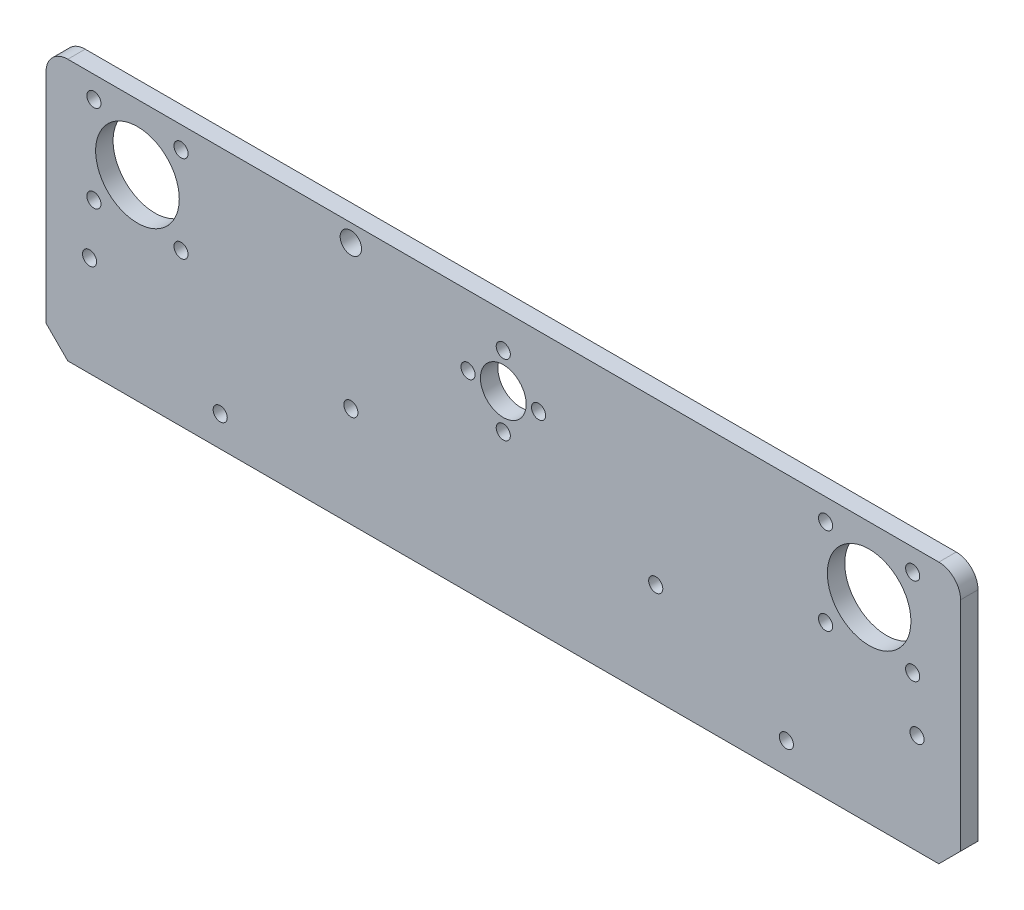
ISO-10303-21;
HEADER;
FILE_DESCRIPTION(('STEP AP214'),'2;1');
FILE_NAME('part.step','',(''),(''),'','','');
FILE_SCHEMA(('AUTOMOTIVE_DESIGN { 1 0 10303 214 1 1 1 1 }'));
ENDSEC;
DATA;
#1=APPLICATION_CONTEXT('core data for automotive mechanical design processes');
#2=APPLICATION_PROTOCOL_DEFINITION('international standard','automotive_design',2000,#1);
#3=PRODUCT_CONTEXT('',#1,'mechanical');
#4=PRODUCT('Part','Part','',(#3));
#5=PRODUCT_RELATED_PRODUCT_CATEGORY('part','',(#4));
#6=PRODUCT_DEFINITION_FORMATION('','',#4);
#7=PRODUCT_DEFINITION_CONTEXT('part definition',#1,'design');
#8=PRODUCT_DEFINITION('design','',#6,#7);
#9=PRODUCT_DEFINITION_SHAPE('','',#8);
#10=(LENGTH_UNIT() NAMED_UNIT(*) SI_UNIT(.MILLI.,.METRE.));
#11=(NAMED_UNIT(*) PLANE_ANGLE_UNIT() SI_UNIT($,.RADIAN.));
#12=(NAMED_UNIT(*) SI_UNIT($,.STERADIAN.) SOLID_ANGLE_UNIT());
#13=UNCERTAINTY_MEASURE_WITH_UNIT(LENGTH_MEASURE(1.E-05),#10,'distance_accuracy_value','');
#14=(GEOMETRIC_REPRESENTATION_CONTEXT(3) GLOBAL_UNCERTAINTY_ASSIGNED_CONTEXT((#13)) GLOBAL_UNIT_ASSIGNED_CONTEXT((#10,
#11,#12)) REPRESENTATION_CONTEXT('',''));
#15=CARTESIAN_POINT('',(0.,0.,0.));
#16=DIRECTION('',(0.,0.,1.));
#17=DIRECTION('',(1.,0.,0.));
#18=AXIS2_PLACEMENT_3D('',#15,#16,#17);
#19=CARTESIAN_POINT('',(0.,0.,4.));
#20=DIRECTION('',(0.,0.,1.));
#21=DIRECTION('',(1.,0.,0.));
#22=AXIS2_PLACEMENT_3D('',#19,#20,#21);
#23=PLANE('',#22);
#24=CARTESIAN_POINT('',(84.,15.,4.));
#25=DIRECTION('',(0.,0.,1.));
#26=DIRECTION('',(1.,0.,0.));
#27=AXIS2_PLACEMENT_3D('',#24,#25,#26);
#28=CIRCLE('',#27,9.6);
#29=CARTESIAN_POINT('',(93.6,15.,4.));
#30=VERTEX_POINT('',#29);
#31=EDGE_CURVE('E258',#30,#30,#28,.F.);
#32=ORIENTED_EDGE('',*,*,#31,.T.);
#33=EDGE_LOOP('',(#32));
#34=FACE_BOUND('',#33,.T.);
#35=CARTESIAN_POINT('',(-84.,15.,4.));
#36=DIRECTION('',(0.,0.,1.));
#37=DIRECTION('',(1.,0.,0.));
#38=AXIS2_PLACEMENT_3D('',#35,#36,#37);
#39=CIRCLE('',#38,9.6);
#40=CARTESIAN_POINT('',(-74.4,15.,4.));
#41=VERTEX_POINT('',#40);
#42=EDGE_CURVE('E261',#41,#41,#39,.F.);
#43=ORIENTED_EDGE('',*,*,#42,.T.);
#44=EDGE_LOOP('',(#43));
#45=FACE_BOUND('',#44,.T.);
#46=CARTESIAN_POINT('',(74.,25.,4.));
#47=DIRECTION('',(0.,0.,1.));
#48=DIRECTION('',(1.,0.,0.));
#49=AXIS2_PLACEMENT_3D('',#46,#47,#48);
#50=CIRCLE('',#49,1.621);
#51=CARTESIAN_POINT('',(75.621,25.,4.));
#52=VERTEX_POINT('',#51);
#53=EDGE_CURVE('E266',#52,#52,#50,.F.);
#54=ORIENTED_EDGE('',*,*,#53,.T.);
#55=EDGE_LOOP('',(#54));
#56=FACE_BOUND('',#55,.T.);
#57=CARTESIAN_POINT('',(94.,5.00000000000002,4.));
#58=DIRECTION('',(0.,0.,1.));
#59=DIRECTION('',(1.,0.,0.));
#60=AXIS2_PLACEMENT_3D('',#57,#58,#59);
#61=CIRCLE('',#60,1.621);
#62=CARTESIAN_POINT('',(95.621,5.00000000000002,4.));
#63=VERTEX_POINT('',#62);
#64=EDGE_CURVE('E271',#63,#63,#61,.F.);
#65=ORIENTED_EDGE('',*,*,#64,.T.);
#66=EDGE_LOOP('',(#65));
#67=FACE_BOUND('',#66,.T.);
#68=CARTESIAN_POINT('',(-94.,5.,4.));
#69=DIRECTION('',(0.,0.,1.));
#70=DIRECTION('',(1.,0.,0.));
#71=AXIS2_PLACEMENT_3D('',#68,#69,#70);
#72=CIRCLE('',#71,1.621);
#73=CARTESIAN_POINT('',(-92.379,5.,4.));
#74=VERTEX_POINT('',#73);
#75=EDGE_CURVE('E276',#74,#74,#72,.F.);
#76=ORIENTED_EDGE('',*,*,#75,.T.);
#77=EDGE_LOOP('',(#76));
#78=FACE_BOUND('',#77,.T.);
#79=CARTESIAN_POINT('',(-74.,25.,4.));
#80=DIRECTION('',(0.,0.,1.));
#81=DIRECTION('',(1.,0.,0.));
#82=AXIS2_PLACEMENT_3D('',#79,#80,#81);
#83=CIRCLE('',#82,1.621);
#84=CARTESIAN_POINT('',(-72.379,25.,4.));
#85=VERTEX_POINT('',#84);
#86=EDGE_CURVE('E281',#85,#85,#83,.F.);
#87=ORIENTED_EDGE('',*,*,#86,.T.);
#88=EDGE_LOOP('',(#87));
#89=FACE_BOUND('',#88,.T.);
#90=CARTESIAN_POINT('',(-74.,5.,4.));
#91=DIRECTION('',(0.,0.,1.));
#92=DIRECTION('',(1.,0.,0.));
#93=AXIS2_PLACEMENT_3D('',#90,#91,#92);
#94=CIRCLE('',#93,1.621);
#95=CARTESIAN_POINT('',(-72.379,5.,4.));
#96=VERTEX_POINT('',#95);
#97=EDGE_CURVE('E286',#96,#96,#94,.F.);
#98=ORIENTED_EDGE('',*,*,#97,.T.);
#99=EDGE_LOOP('',(#98));
#100=FACE_BOUND('',#99,.T.);
#101=CARTESIAN_POINT('',(-94.,25.,4.));
#102=DIRECTION('',(0.,0.,1.));
#103=DIRECTION('',(1.,0.,0.));
#104=AXIS2_PLACEMENT_3D('',#101,#102,#103);
#105=CIRCLE('',#104,1.621);
#106=CARTESIAN_POINT('',(-92.379,25.,4.));
#107=VERTEX_POINT('',#106);
#108=EDGE_CURVE('E291',#107,#107,#105,.F.);
#109=ORIENTED_EDGE('',*,*,#108,.T.);
#110=EDGE_LOOP('',(#109));
#111=FACE_BOUND('',#110,.T.);
#112=CARTESIAN_POINT('',(94.,25.,4.));
#113=DIRECTION('',(0.,0.,1.));
#114=DIRECTION('',(1.,0.,0.));
#115=AXIS2_PLACEMENT_3D('',#112,#113,#114);
#116=CIRCLE('',#115,1.621);
#117=CARTESIAN_POINT('',(95.621,25.,4.));
#118=VERTEX_POINT('',#117);
#119=EDGE_CURVE('E296',#118,#118,#116,.F.);
#120=ORIENTED_EDGE('',*,*,#119,.T.);
#121=EDGE_LOOP('',(#120));
#122=FACE_BOUND('',#121,.T.);
#123=CARTESIAN_POINT('',(74.,5.00000000000001,4.));
#124=DIRECTION('',(0.,0.,1.));
#125=DIRECTION('',(1.,0.,0.));
#126=AXIS2_PLACEMENT_3D('',#123,#124,#125);
#127=CIRCLE('',#126,1.621);
#128=CARTESIAN_POINT('',(75.621,5.00000000000001,4.));
#129=VERTEX_POINT('',#128);
#130=EDGE_CURVE('E301',#129,#129,#127,.F.);
#131=ORIENTED_EDGE('',*,*,#130,.T.);
#132=EDGE_LOOP('',(#131));
#133=FACE_BOUND('',#132,.T.);
#134=CARTESIAN_POINT('',(-95.,-7.,4.));
#135=DIRECTION('',(0.,0.,1.));
#136=DIRECTION('',(1.,0.,0.));
#137=AXIS2_PLACEMENT_3D('',#134,#135,#136);
#138=CIRCLE('',#137,1.621);
#139=CARTESIAN_POINT('',(-93.379,-7.,4.));
#140=VERTEX_POINT('',#139);
#141=EDGE_CURVE('E306',#140,#140,#138,.F.);
#142=ORIENTED_EDGE('',*,*,#141,.T.);
#143=EDGE_LOOP('',(#142));
#144=FACE_BOUND('',#143,.T.);
#145=CARTESIAN_POINT('',(65.,-23.,4.));
#146=DIRECTION('',(0.,0.,1.));
#147=DIRECTION('',(1.,0.,0.));
#148=AXIS2_PLACEMENT_3D('',#145,#146,#147);
#149=CIRCLE('',#148,1.621);
#150=CARTESIAN_POINT('',(66.621,-23.,4.));
#151=VERTEX_POINT('',#150);
#152=EDGE_CURVE('E311',#151,#151,#149,.F.);
#153=ORIENTED_EDGE('',*,*,#152,.T.);
#154=EDGE_LOOP('',(#153));
#155=FACE_BOUND('',#154,.T.);
#156=CARTESIAN_POINT('',(35.,-7.,4.));
#157=DIRECTION('',(0.,0.,1.));
#158=DIRECTION('',(1.,0.,0.));
#159=AXIS2_PLACEMENT_3D('',#156,#157,#158);
#160=CIRCLE('',#159,1.621);
#161=CARTESIAN_POINT('',(36.621,-7.,4.));
#162=VERTEX_POINT('',#161);
#163=EDGE_CURVE('E316',#162,#162,#160,.F.);
#164=ORIENTED_EDGE('',*,*,#163,.T.);
#165=EDGE_LOOP('',(#164));
#166=FACE_BOUND('',#165,.T.);
#167=CARTESIAN_POINT('',(-35.,-7.,4.));
#168=DIRECTION('',(0.,0.,1.));
#169=DIRECTION('',(1.,0.,0.));
#170=AXIS2_PLACEMENT_3D('',#167,#168,#169);
#171=CIRCLE('',#170,1.621);
#172=CARTESIAN_POINT('',(-33.379,-7.,4.));
#173=VERTEX_POINT('',#172);
#174=EDGE_CURVE('E321',#173,#173,#171,.F.);
#175=ORIENTED_EDGE('',*,*,#174,.T.);
#176=EDGE_LOOP('',(#175));
#177=FACE_BOUND('',#176,.T.);
#178=CARTESIAN_POINT('',(95.,-7.,4.));
#179=DIRECTION('',(0.,0.,1.));
#180=DIRECTION('',(1.,0.,0.));
#181=AXIS2_PLACEMENT_3D('',#178,#179,#180);
#182=CIRCLE('',#181,1.621);
#183=CARTESIAN_POINT('',(96.621,-7.,4.));
#184=VERTEX_POINT('',#183);
#185=EDGE_CURVE('E326',#184,#184,#182,.F.);
#186=ORIENTED_EDGE('',*,*,#185,.T.);
#187=EDGE_LOOP('',(#186));
#188=FACE_BOUND('',#187,.T.);
#189=CARTESIAN_POINT('',(-65.,-23.,4.));
#190=DIRECTION('',(0.,0.,1.));
#191=DIRECTION('',(1.,0.,0.));
#192=AXIS2_PLACEMENT_3D('',#189,#190,#191);
#193=CIRCLE('',#192,1.621);
#194=CARTESIAN_POINT('',(-63.379,-23.,4.));
#195=VERTEX_POINT('',#194);
#196=EDGE_CURVE('E331',#195,#195,#193,.F.);
#197=ORIENTED_EDGE('',*,*,#196,.T.);
#198=EDGE_LOOP('',(#197));
#199=FACE_BOUND('',#198,.T.);
#200=CARTESIAN_POINT('',(0.,14.,4.));
#201=DIRECTION('',(0.,0.,-1.));
#202=DIRECTION('',(-1.,0.,0.));
#203=AXIS2_PLACEMENT_3D('',#200,#201,#202);
#204=CIRCLE('',#203,5.25);
#205=CARTESIAN_POINT('',(-5.25,14.,4.));
#206=VERTEX_POINT('',#205);
#207=EDGE_CURVE('E336',#206,#206,#204,.T.);
#208=ORIENTED_EDGE('',*,*,#207,.T.);
#209=EDGE_LOOP('',(#208));
#210=FACE_BOUND('',#209,.T.);
#211=CARTESIAN_POINT('',(0.,22.1,4.));
#212=DIRECTION('',(0.,0.,1.));
#213=DIRECTION('',(1.,0.,0.));
#214=AXIS2_PLACEMENT_3D('',#211,#212,#213);
#215=CIRCLE('',#214,1.621);
#216=CARTESIAN_POINT('',(1.621,22.1,4.));
#217=VERTEX_POINT('',#216);
#218=EDGE_CURVE('E341',#217,#217,#215,.F.);
#219=ORIENTED_EDGE('',*,*,#218,.T.);
#220=EDGE_LOOP('',(#219));
#221=FACE_BOUND('',#220,.T.);
#222=CARTESIAN_POINT('',(-8.1,14.,4.));
#223=DIRECTION('',(0.,0.,1.));
#224=DIRECTION('',(1.,0.,0.));
#225=AXIS2_PLACEMENT_3D('',#222,#223,#224);
#226=CIRCLE('',#225,1.621);
#227=CARTESIAN_POINT('',(-6.479,14.,4.));
#228=VERTEX_POINT('',#227);
#229=EDGE_CURVE('E346',#228,#228,#226,.F.);
#230=ORIENTED_EDGE('',*,*,#229,.T.);
#231=EDGE_LOOP('',(#230));
#232=FACE_BOUND('',#231,.T.);
#233=CARTESIAN_POINT('',(8.1,14.,4.));
#234=DIRECTION('',(0.,0.,1.));
#235=DIRECTION('',(1.,0.,0.));
#236=AXIS2_PLACEMENT_3D('',#233,#234,#235);
#237=CIRCLE('',#236,1.621);
#238=CARTESIAN_POINT('',(9.721,14.,4.));
#239=VERTEX_POINT('',#238);
#240=EDGE_CURVE('E351',#239,#239,#237,.F.);
#241=ORIENTED_EDGE('',*,*,#240,.T.);
#242=EDGE_LOOP('',(#241));
#243=FACE_BOUND('',#242,.T.);
#244=CARTESIAN_POINT('',(0.,5.9,4.));
#245=DIRECTION('',(0.,0.,1.));
#246=DIRECTION('',(1.,0.,0.));
#247=AXIS2_PLACEMENT_3D('',#244,#245,#246);
#248=CIRCLE('',#247,1.621);
#249=CARTESIAN_POINT('',(1.621,5.9,4.));
#250=VERTEX_POINT('',#249);
#251=EDGE_CURVE('E356',#250,#250,#248,.F.);
#252=ORIENTED_EDGE('',*,*,#251,.T.);
#253=EDGE_LOOP('',(#252));
#254=FACE_BOUND('',#253,.T.);
#255=CARTESIAN_POINT('',(-35.,26.,4.));
#256=DIRECTION('',(0.,0.,1.));
#257=DIRECTION('',(1.,0.,0.));
#258=AXIS2_PLACEMENT_3D('',#255,#256,#257);
#259=CIRCLE('',#258,2.4585);
#260=CARTESIAN_POINT('',(-32.5415,26.,4.));
#261=VERTEX_POINT('',#260);
#262=EDGE_CURVE('E108',#261,#261,#259,.F.);
#263=ORIENTED_EDGE('',*,*,#262,.T.);
#264=EDGE_LOOP('',(#263));
#265=FACE_BOUND('',#264,.T.);
#266=DIRECTION('',(0.707106781186548,-0.707106781186548,0.));
#267=VECTOR('',#266,1.);
#268=CARTESIAN_POINT('',(-102.5,-27.5,4.));
#269=LINE('',#268,#267);
#270=CARTESIAN_POINT('',(-100.,-30.,4.));
#271=VERTEX_POINT('',#270);
#272=CARTESIAN_POINT('',(-105.,-25.,4.));
#273=VERTEX_POINT('',#272);
#274=EDGE_CURVE('E131',#271,#273,#269,.F.);
#275=ORIENTED_EDGE('',*,*,#274,.F.);
#276=DIRECTION('',(1.,0.,0.));
#277=VECTOR('',#276,1.);
#278=CARTESIAN_POINT('',(-105.,-30.,4.));
#279=LINE('',#278,#277);
#280=CARTESIAN_POINT('',(100.,-30.,4.));
#281=VERTEX_POINT('',#280);
#282=EDGE_CURVE('E123',#281,#271,#279,.F.);
#283=ORIENTED_EDGE('',*,*,#282,.F.);
#284=DIRECTION('',(0.707106781186548,0.707106781186548,0.));
#285=VECTOR('',#284,1.);
#286=CARTESIAN_POINT('',(102.5,-27.5,4.));
#287=LINE('',#286,#285);
#288=CARTESIAN_POINT('',(105.,-25.,4.));
#289=VERTEX_POINT('',#288);
#290=EDGE_CURVE('E93',#289,#281,#287,.F.);
#291=ORIENTED_EDGE('',*,*,#290,.F.);
#292=DIRECTION('',(0.,1.,0.));
#293=VECTOR('',#292,1.);
#294=CARTESIAN_POINT('',(105.,-30.,4.));
#295=LINE('',#294,#293);
#296=CARTESIAN_POINT('',(105.,25.,4.));
#297=VERTEX_POINT('',#296);
#298=EDGE_CURVE('E89',#297,#289,#295,.F.);
#299=ORIENTED_EDGE('',*,*,#298,.F.);
#300=CARTESIAN_POINT('',(100.,25.,4.));
#301=DIRECTION('',(0.,0.,1.));
#302=DIRECTION('',(1.,0.,0.));
#303=AXIS2_PLACEMENT_3D('',#300,#301,#302);
#304=CIRCLE('',#303,5.);
#305=CARTESIAN_POINT('',(100.,30.,4.));
#306=VERTEX_POINT('',#305);
#307=EDGE_CURVE('E20',#306,#297,#304,.F.);
#308=ORIENTED_EDGE('',*,*,#307,.F.);
#309=DIRECTION('',(1.,0.,0.));
#310=VECTOR('',#309,1.);
#311=CARTESIAN_POINT('',(105.,30.,4.));
#312=LINE('',#311,#310);
#313=CARTESIAN_POINT('',(-100.,30.,4.));
#314=VERTEX_POINT('',#313);
#315=EDGE_CURVE('E102',#314,#306,#312,.T.);
#316=ORIENTED_EDGE('',*,*,#315,.F.);
#317=CARTESIAN_POINT('',(-100.,25.,4.));
#318=DIRECTION('',(0.,0.,1.));
#319=DIRECTION('',(1.,0.,0.));
#320=AXIS2_PLACEMENT_3D('',#317,#318,#319);
#321=CIRCLE('',#320,5.);
#322=CARTESIAN_POINT('',(-105.,25.,4.));
#323=VERTEX_POINT('',#322);
#324=EDGE_CURVE('E144',#323,#314,#321,.F.);
#325=ORIENTED_EDGE('',*,*,#324,.F.);
#326=DIRECTION('',(0.,1.,0.));
#327=VECTOR('',#326,1.);
#328=CARTESIAN_POINT('',(-105.,30.,4.));
#329=LINE('',#328,#327);
#330=EDGE_CURVE('E139',#273,#323,#329,.T.);
#331=ORIENTED_EDGE('',*,*,#330,.F.);
#332=EDGE_LOOP('',(#275,#283,#291,#299,#308,#316,#325,#331));
#333=FACE_BOUND('',#332,.T.);
#334=ADVANCED_FACE('F17',(#34,#45,#56,#67,#78,#89,#100,#111,#122,#133,#144,#155,#166,#177,#188,
#199,#210,#221,#232,#243,#254,#265,#333),#23,.T.);
#335=CARTESIAN_POINT('',(105.,-30.,0.));
#336=DIRECTION('',(1.,0.,0.));
#337=DIRECTION('',(0.,0.,-1.));
#338=AXIS2_PLACEMENT_3D('',#335,#336,#337);
#339=PLANE('',#338);
#340=DIRECTION('',(0.,0.,1.));
#341=VECTOR('',#340,1.);
#342=CARTESIAN_POINT('',(105.,25.,0.));
#343=LINE('',#342,#341);
#344=CARTESIAN_POINT('',(105.,25.,0.));
#345=VERTEX_POINT('',#344);
#346=EDGE_CURVE('E86',#297,#345,#343,.F.);
#347=ORIENTED_EDGE('',*,*,#346,.F.);
#348=ORIENTED_EDGE('',*,*,#298,.T.);
#349=DIRECTION('',(0.,0.,1.));
#350=VECTOR('',#349,1.);
#351=CARTESIAN_POINT('',(105.,-25.,0.));
#352=LINE('',#351,#350);
#353=CARTESIAN_POINT('',(105.,-25.,0.));
#354=VERTEX_POINT('',#353);
#355=EDGE_CURVE('E106',#354,#289,#352,.T.);
#356=ORIENTED_EDGE('',*,*,#355,.F.);
#357=DIRECTION('',(0.,1.,0.));
#358=VECTOR('',#357,1.);
#359=CARTESIAN_POINT('',(105.,0.,0.));
#360=LINE('',#359,#358);
#361=EDGE_CURVE('E100',#354,#345,#360,.T.);
#362=ORIENTED_EDGE('',*,*,#361,.T.);
#363=EDGE_LOOP('',(#347,#348,#356,#362));
#364=FACE_BOUND('',#363,.T.);
#365=ADVANCED_FACE('F99',(#364),#339,.T.);
#366=CARTESIAN_POINT('',(100.,25.,0.));
#367=DIRECTION('',(0.,0.,1.));
#368=DIRECTION('',(1.,0.,0.));
#369=AXIS2_PLACEMENT_3D('',#366,#367,#368);
#370=CYLINDRICAL_SURFACE('',#369,5.);
#371=CARTESIAN_POINT('',(100.,25.,0.));
#372=DIRECTION('',(0.,0.,1.));
#373=DIRECTION('',(1.,0.,0.));
#374=AXIS2_PLACEMENT_3D('',#371,#372,#373);
#375=CIRCLE('',#374,5.);
#376=CARTESIAN_POINT('',(100.,30.,0.));
#377=VERTEX_POINT('',#376);
#378=EDGE_CURVE('E256',#345,#377,#375,.T.);
#379=ORIENTED_EDGE('',*,*,#378,.T.);
#380=DIRECTION('',(0.,0.,1.));
#381=VECTOR('',#380,1.);
#382=CARTESIAN_POINT('',(100.,30.,0.));
#383=LINE('',#382,#381);
#384=EDGE_CURVE('E88',#306,#377,#383,.F.);
#385=ORIENTED_EDGE('',*,*,#384,.F.);
#386=ORIENTED_EDGE('',*,*,#307,.T.);
#387=ORIENTED_EDGE('',*,*,#346,.T.);
#388=EDGE_LOOP('',(#379,#385,#386,#387));
#389=FACE_BOUND('',#388,.T.);
#390=ADVANCED_FACE('F84',(#389),#370,.T.);
#391=CARTESIAN_POINT('',(105.,30.,0.));
#392=DIRECTION('',(0.,1.,0.));
#393=DIRECTION('',(0.,0.,1.));
#394=AXIS2_PLACEMENT_3D('',#391,#392,#393);
#395=PLANE('',#394);
#396=DIRECTION('',(0.,0.,1.));
#397=VECTOR('',#396,1.);
#398=CARTESIAN_POINT('',(-100.,30.,0.));
#399=LINE('',#398,#397);
#400=CARTESIAN_POINT('',(-100.,30.,0.));
#401=VERTEX_POINT('',#400);
#402=EDGE_CURVE('E141',#314,#401,#399,.F.);
#403=ORIENTED_EDGE('',*,*,#402,.F.);
#404=ORIENTED_EDGE('',*,*,#315,.T.);
#405=ORIENTED_EDGE('',*,*,#384,.T.);
#406=DIRECTION('',(1.,0.,0.));
#407=VECTOR('',#406,1.);
#408=CARTESIAN_POINT('',(0.,30.,0.));
#409=LINE('',#408,#407);
#410=EDGE_CURVE('E255',#377,#401,#409,.F.);
#411=ORIENTED_EDGE('',*,*,#410,.T.);
#412=EDGE_LOOP('',(#403,#404,#405,#411));
#413=FACE_BOUND('',#412,.T.);
#414=ADVANCED_FACE('F408',(#413),#395,.T.);
#415=CARTESIAN_POINT('',(-100.,25.,0.));
#416=DIRECTION('',(0.,0.,1.));
#417=DIRECTION('',(1.,0.,0.));
#418=AXIS2_PLACEMENT_3D('',#415,#416,#417);
#419=CYLINDRICAL_SURFACE('',#418,5.);
#420=CARTESIAN_POINT('',(-100.,25.,0.));
#421=DIRECTION('',(0.,0.,1.));
#422=DIRECTION('',(1.,0.,0.));
#423=AXIS2_PLACEMENT_3D('',#420,#421,#422);
#424=CIRCLE('',#423,5.);
#425=CARTESIAN_POINT('',(-105.,25.,0.));
#426=VERTEX_POINT('',#425);
#427=EDGE_CURVE('E251',#401,#426,#424,.T.);
#428=ORIENTED_EDGE('',*,*,#427,.T.);
#429=DIRECTION('',(0.,0.,1.));
#430=VECTOR('',#429,1.);
#431=CARTESIAN_POINT('',(-105.,25.,0.));
#432=LINE('',#431,#430);
#433=EDGE_CURVE('E133',#323,#426,#432,.F.);
#434=ORIENTED_EDGE('',*,*,#433,.F.);
#435=ORIENTED_EDGE('',*,*,#324,.T.);
#436=ORIENTED_EDGE('',*,*,#402,.T.);
#437=EDGE_LOOP('',(#428,#434,#435,#436));
#438=FACE_BOUND('',#437,.T.);
#439=ADVANCED_FACE('F406',(#438),#419,.T.);
#440=CARTESIAN_POINT('',(-105.,30.,0.));
#441=DIRECTION('',(-1.,0.,0.));
#442=DIRECTION('',(0.,0.,1.));
#443=AXIS2_PLACEMENT_3D('',#440,#441,#442);
#444=PLANE('',#443);
#445=ORIENTED_EDGE('',*,*,#433,.T.);
#446=DIRECTION('',(0.,1.,0.));
#447=VECTOR('',#446,1.);
#448=CARTESIAN_POINT('',(-105.,0.,0.));
#449=LINE('',#448,#447);
#450=CARTESIAN_POINT('',(-105.,-25.,0.));
#451=VERTEX_POINT('',#450);
#452=EDGE_CURVE('E254',#426,#451,#449,.F.);
#453=ORIENTED_EDGE('',*,*,#452,.T.);
#454=DIRECTION('',(0.,0.,1.));
#455=VECTOR('',#454,1.);
#456=CARTESIAN_POINT('',(-105.,-25.,0.));
#457=LINE('',#456,#455);
#458=EDGE_CURVE('E125',#273,#451,#457,.F.);
#459=ORIENTED_EDGE('',*,*,#458,.F.);
#460=ORIENTED_EDGE('',*,*,#330,.T.);
#461=EDGE_LOOP('',(#445,#453,#459,#460));
#462=FACE_BOUND('',#461,.T.);
#463=ADVANCED_FACE('F404',(#462),#444,.T.);
#464=CARTESIAN_POINT('',(-102.5,-27.5,0.));
#465=DIRECTION('',(-0.707106781186548,-0.707106781186548,0.));
#466=DIRECTION('',(0.707106781186548,-0.707106781186548,0.));
#467=AXIS2_PLACEMENT_3D('',#464,#465,#466);
#468=PLANE('',#467);
#469=DIRECTION('',(0.707106781186547,-0.707106781186548,0.));
#470=VECTOR('',#469,1.);
#471=CARTESIAN_POINT('',(-105.,-25.,0.));
#472=LINE('',#471,#470);
#473=CARTESIAN_POINT('',(-100.,-30.,0.));
#474=VERTEX_POINT('',#473);
#475=EDGE_CURVE('E377',#451,#474,#472,.T.);
#476=ORIENTED_EDGE('',*,*,#475,.T.);
#477=DIRECTION('',(0.,0.,-1.));
#478=VECTOR('',#477,1.);
#479=CARTESIAN_POINT('',(-100.,-30.,0.));
#480=LINE('',#479,#478);
#481=EDGE_CURVE('E120',#271,#474,#480,.T.);
#482=ORIENTED_EDGE('',*,*,#481,.F.);
#483=ORIENTED_EDGE('',*,*,#274,.T.);
#484=ORIENTED_EDGE('',*,*,#458,.T.);
#485=EDGE_LOOP('',(#476,#482,#483,#484));
#486=FACE_BOUND('',#485,.T.);
#487=ADVANCED_FACE('F400',(#486),#468,.T.);
#488=CARTESIAN_POINT('',(-105.,-30.,0.));
#489=DIRECTION('',(0.,-1.,0.));
#490=DIRECTION('',(0.,0.,-1.));
#491=AXIS2_PLACEMENT_3D('',#488,#489,#490);
#492=PLANE('',#491);
#493=ORIENTED_EDGE('',*,*,#481,.T.);
#494=DIRECTION('',(1.,0.,0.));
#495=VECTOR('',#494,1.);
#496=CARTESIAN_POINT('',(0.,-30.,0.));
#497=LINE('',#496,#495);
#498=CARTESIAN_POINT('',(100.,-30.,0.));
#499=VERTEX_POINT('',#498);
#500=EDGE_CURVE('E114',#474,#499,#497,.T.);
#501=ORIENTED_EDGE('',*,*,#500,.T.);
#502=DIRECTION('',(0.,0.,1.));
#503=VECTOR('',#502,1.);
#504=CARTESIAN_POINT('',(100.,-30.,0.));
#505=LINE('',#504,#503);
#506=EDGE_CURVE('E35',#281,#499,#505,.F.);
#507=ORIENTED_EDGE('',*,*,#506,.F.);
#508=ORIENTED_EDGE('',*,*,#282,.T.);
#509=EDGE_LOOP('',(#493,#501,#507,#508));
#510=FACE_BOUND('',#509,.T.);
#511=ADVANCED_FACE('F393',(#510),#492,.T.);
#512=CARTESIAN_POINT('',(102.5,-27.5,0.));
#513=DIRECTION('',(0.707106781186548,-0.707106781186548,0.));
#514=DIRECTION('',(0.707106781186548,0.707106781186548,0.));
#515=AXIS2_PLACEMENT_3D('',#512,#513,#514);
#516=PLANE('',#515);
#517=DIRECTION('',(0.707106781186547,0.707106781186548,0.));
#518=VECTOR('',#517,1.);
#519=CARTESIAN_POINT('',(100.,-30.,0.));
#520=LINE('',#519,#518);
#521=EDGE_CURVE('E111',#499,#354,#520,.T.);
#522=ORIENTED_EDGE('',*,*,#521,.T.);
#523=ORIENTED_EDGE('',*,*,#355,.T.);
#524=ORIENTED_EDGE('',*,*,#290,.T.);
#525=ORIENTED_EDGE('',*,*,#506,.T.);
#526=EDGE_LOOP('',(#522,#523,#524,#525));
#527=FACE_BOUND('',#526,.T.);
#528=ADVANCED_FACE('F513',(#527),#516,.T.);
#529=CARTESIAN_POINT('',(-35.,26.,-4.55));
#530=DIRECTION('',(0.,0.,1.));
#531=DIRECTION('',(1.,0.,0.));
#532=AXIS2_PLACEMENT_3D('',#529,#530,#531);
#533=CYLINDRICAL_SURFACE('',#532,2.4585);
#534=ORIENTED_EDGE('',*,*,#262,.F.);
#535=EDGE_LOOP('',(#534));
#536=FACE_BOUND('',#535,.T.);
#537=CARTESIAN_POINT('',(-35.,26.,0.));
#538=DIRECTION('',(0.,0.,1.));
#539=DIRECTION('',(1.,0.,0.));
#540=AXIS2_PLACEMENT_3D('',#537,#538,#539);
#541=CIRCLE('',#540,2.4585);
#542=CARTESIAN_POINT('',(-32.5415,26.,0.));
#543=VERTEX_POINT('',#542);
#544=EDGE_CURVE('E113',#543,#543,#541,.F.);
#545=ORIENTED_EDGE('',*,*,#544,.T.);
#546=EDGE_LOOP('',(#545));
#547=FACE_BOUND('',#546,.T.);
#548=ADVANCED_FACE('F509',(#536,#547),#533,.F.);
#549=CARTESIAN_POINT('',(0.,5.9,-1.9));
#550=DIRECTION('',(0.,0.,1.));
#551=DIRECTION('',(1.,0.,0.));
#552=AXIS2_PLACEMENT_3D('',#549,#550,#551);
#553=CYLINDRICAL_SURFACE('',#552,1.621);
#554=ORIENTED_EDGE('',*,*,#251,.F.);
#555=EDGE_LOOP('',(#554));
#556=FACE_BOUND('',#555,.T.);
#557=CARTESIAN_POINT('',(0.,5.9,0.));
#558=DIRECTION('',(0.,0.,1.));
#559=DIRECTION('',(1.,0.,0.));
#560=AXIS2_PLACEMENT_3D('',#557,#558,#559);
#561=CIRCLE('',#560,1.621);
#562=CARTESIAN_POINT('',(1.621,5.9,0.));
#563=VERTEX_POINT('',#562);
#564=EDGE_CURVE('E240',#563,#563,#561,.F.);
#565=ORIENTED_EDGE('',*,*,#564,.T.);
#566=EDGE_LOOP('',(#565));
#567=FACE_BOUND('',#566,.T.);
#568=ADVANCED_FACE('F505',(#556,#567),#553,.F.);
#569=CARTESIAN_POINT('',(8.1,14.,-1.9));
#570=DIRECTION('',(0.,0.,1.));
#571=DIRECTION('',(1.,0.,0.));
#572=AXIS2_PLACEMENT_3D('',#569,#570,#571);
#573=CYLINDRICAL_SURFACE('',#572,1.621);
#574=ORIENTED_EDGE('',*,*,#240,.F.);
#575=EDGE_LOOP('',(#574));
#576=FACE_BOUND('',#575,.T.);
#577=CARTESIAN_POINT('',(8.1,14.,0.));
#578=DIRECTION('',(0.,0.,1.));
#579=DIRECTION('',(1.,0.,0.));
#580=AXIS2_PLACEMENT_3D('',#577,#578,#579);
#581=CIRCLE('',#580,1.621);
#582=CARTESIAN_POINT('',(9.721,14.,0.));
#583=VERTEX_POINT('',#582);
#584=EDGE_CURVE('E235',#583,#583,#581,.F.);
#585=ORIENTED_EDGE('',*,*,#584,.T.);
#586=EDGE_LOOP('',(#585));
#587=FACE_BOUND('',#586,.T.);
#588=ADVANCED_FACE('F501',(#576,#587),#573,.F.);
#589=CARTESIAN_POINT('',(-8.1,14.,-1.9));
#590=DIRECTION('',(0.,0.,1.));
#591=DIRECTION('',(1.,0.,0.));
#592=AXIS2_PLACEMENT_3D('',#589,#590,#591);
#593=CYLINDRICAL_SURFACE('',#592,1.621);
#594=ORIENTED_EDGE('',*,*,#229,.F.);
#595=EDGE_LOOP('',(#594));
#596=FACE_BOUND('',#595,.T.);
#597=CARTESIAN_POINT('',(-8.1,14.,0.));
#598=DIRECTION('',(0.,0.,1.));
#599=DIRECTION('',(1.,0.,0.));
#600=AXIS2_PLACEMENT_3D('',#597,#598,#599);
#601=CIRCLE('',#600,1.621);
#602=CARTESIAN_POINT('',(-6.479,14.,0.));
#603=VERTEX_POINT('',#602);
#604=EDGE_CURVE('E230',#603,#603,#601,.F.);
#605=ORIENTED_EDGE('',*,*,#604,.T.);
#606=EDGE_LOOP('',(#605));
#607=FACE_BOUND('',#606,.T.);
#608=ADVANCED_FACE('F497',(#596,#607),#593,.F.);
#609=CARTESIAN_POINT('',(0.,22.1,-1.9));
#610=DIRECTION('',(0.,0.,1.));
#611=DIRECTION('',(1.,0.,0.));
#612=AXIS2_PLACEMENT_3D('',#609,#610,#611);
#613=CYLINDRICAL_SURFACE('',#612,1.621);
#614=ORIENTED_EDGE('',*,*,#218,.F.);
#615=EDGE_LOOP('',(#614));
#616=FACE_BOUND('',#615,.T.);
#617=CARTESIAN_POINT('',(0.,22.1,0.));
#618=DIRECTION('',(0.,0.,1.));
#619=DIRECTION('',(1.,0.,0.));
#620=AXIS2_PLACEMENT_3D('',#617,#618,#619);
#621=CIRCLE('',#620,1.621);
#622=CARTESIAN_POINT('',(1.621,22.1,0.));
#623=VERTEX_POINT('',#622);
#624=EDGE_CURVE('E225',#623,#623,#621,.F.);
#625=ORIENTED_EDGE('',*,*,#624,.T.);
#626=EDGE_LOOP('',(#625));
#627=FACE_BOUND('',#626,.T.);
#628=ADVANCED_FACE('F493',(#616,#627),#613,.F.);
#629=CARTESIAN_POINT('',(0.,14.,4.));
#630=DIRECTION('',(0.,0.,-1.));
#631=DIRECTION('',(-1.,0.,0.));
#632=AXIS2_PLACEMENT_3D('',#629,#630,#631);
#633=CYLINDRICAL_SURFACE('',#632,5.25);
#634=ORIENTED_EDGE('',*,*,#207,.F.);
#635=EDGE_LOOP('',(#634));
#636=FACE_BOUND('',#635,.T.);
#637=CARTESIAN_POINT('',(0.,14.,0.));
#638=DIRECTION('',(0.,0.,-1.));
#639=DIRECTION('',(-1.,0.,0.));
#640=AXIS2_PLACEMENT_3D('',#637,#638,#639);
#641=CIRCLE('',#640,5.25);
#642=CARTESIAN_POINT('',(-5.25,14.,0.));
#643=VERTEX_POINT('',#642);
#644=EDGE_CURVE('E220',#643,#643,#641,.T.);
#645=ORIENTED_EDGE('',*,*,#644,.T.);
#646=EDGE_LOOP('',(#645));
#647=FACE_BOUND('',#646,.T.);
#648=ADVANCED_FACE('F489',(#636,#647),#633,.F.);
#649=CARTESIAN_POINT('',(-65.,-23.,-1.9));
#650=DIRECTION('',(0.,0.,1.));
#651=DIRECTION('',(1.,0.,0.));
#652=AXIS2_PLACEMENT_3D('',#649,#650,#651);
#653=CYLINDRICAL_SURFACE('',#652,1.621);
#654=ORIENTED_EDGE('',*,*,#196,.F.);
#655=EDGE_LOOP('',(#654));
#656=FACE_BOUND('',#655,.T.);
#657=CARTESIAN_POINT('',(-65.,-23.,0.));
#658=DIRECTION('',(0.,0.,1.));
#659=DIRECTION('',(1.,0.,0.));
#660=AXIS2_PLACEMENT_3D('',#657,#658,#659);
#661=CIRCLE('',#660,1.621);
#662=CARTESIAN_POINT('',(-63.379,-23.,0.));
#663=VERTEX_POINT('',#662);
#664=EDGE_CURVE('E215',#663,#663,#661,.F.);
#665=ORIENTED_EDGE('',*,*,#664,.T.);
#666=EDGE_LOOP('',(#665));
#667=FACE_BOUND('',#666,.T.);
#668=ADVANCED_FACE('F485',(#656,#667),#653,.F.);
#669=CARTESIAN_POINT('',(95.,-7.,-1.9));
#670=DIRECTION('',(0.,0.,1.));
#671=DIRECTION('',(1.,0.,0.));
#672=AXIS2_PLACEMENT_3D('',#669,#670,#671);
#673=CYLINDRICAL_SURFACE('',#672,1.621);
#674=ORIENTED_EDGE('',*,*,#185,.F.);
#675=EDGE_LOOP('',(#674));
#676=FACE_BOUND('',#675,.T.);
#677=CARTESIAN_POINT('',(95.,-7.,0.));
#678=DIRECTION('',(0.,0.,1.));
#679=DIRECTION('',(1.,0.,0.));
#680=AXIS2_PLACEMENT_3D('',#677,#678,#679);
#681=CIRCLE('',#680,1.621);
#682=CARTESIAN_POINT('',(96.621,-7.,0.));
#683=VERTEX_POINT('',#682);
#684=EDGE_CURVE('E210',#683,#683,#681,.F.);
#685=ORIENTED_EDGE('',*,*,#684,.T.);
#686=EDGE_LOOP('',(#685));
#687=FACE_BOUND('',#686,.T.);
#688=ADVANCED_FACE('F481',(#676,#687),#673,.F.);
#689=CARTESIAN_POINT('',(-35.,-7.,-1.9));
#690=DIRECTION('',(0.,0.,1.));
#691=DIRECTION('',(1.,0.,0.));
#692=AXIS2_PLACEMENT_3D('',#689,#690,#691);
#693=CYLINDRICAL_SURFACE('',#692,1.621);
#694=ORIENTED_EDGE('',*,*,#174,.F.);
#695=EDGE_LOOP('',(#694));
#696=FACE_BOUND('',#695,.T.);
#697=CARTESIAN_POINT('',(-35.,-7.,0.));
#698=DIRECTION('',(0.,0.,1.));
#699=DIRECTION('',(1.,0.,0.));
#700=AXIS2_PLACEMENT_3D('',#697,#698,#699);
#701=CIRCLE('',#700,1.621);
#702=CARTESIAN_POINT('',(-33.379,-7.,0.));
#703=VERTEX_POINT('',#702);
#704=EDGE_CURVE('E205',#703,#703,#701,.F.);
#705=ORIENTED_EDGE('',*,*,#704,.T.);
#706=EDGE_LOOP('',(#705));
#707=FACE_BOUND('',#706,.T.);
#708=ADVANCED_FACE('F477',(#696,#707),#693,.F.);
#709=CARTESIAN_POINT('',(35.,-7.,-1.9));
#710=DIRECTION('',(0.,0.,1.));
#711=DIRECTION('',(1.,0.,0.));
#712=AXIS2_PLACEMENT_3D('',#709,#710,#711);
#713=CYLINDRICAL_SURFACE('',#712,1.621);
#714=ORIENTED_EDGE('',*,*,#163,.F.);
#715=EDGE_LOOP('',(#714));
#716=FACE_BOUND('',#715,.T.);
#717=CARTESIAN_POINT('',(35.,-7.,0.));
#718=DIRECTION('',(0.,0.,1.));
#719=DIRECTION('',(1.,0.,0.));
#720=AXIS2_PLACEMENT_3D('',#717,#718,#719);
#721=CIRCLE('',#720,1.621);
#722=CARTESIAN_POINT('',(36.621,-7.,0.));
#723=VERTEX_POINT('',#722);
#724=EDGE_CURVE('E200',#723,#723,#721,.F.);
#725=ORIENTED_EDGE('',*,*,#724,.T.);
#726=EDGE_LOOP('',(#725));
#727=FACE_BOUND('',#726,.T.);
#728=ADVANCED_FACE('F473',(#716,#727),#713,.F.);
#729=CARTESIAN_POINT('',(65.,-23.,-1.9));
#730=DIRECTION('',(0.,0.,1.));
#731=DIRECTION('',(1.,0.,0.));
#732=AXIS2_PLACEMENT_3D('',#729,#730,#731);
#733=CYLINDRICAL_SURFACE('',#732,1.621);
#734=ORIENTED_EDGE('',*,*,#152,.F.);
#735=EDGE_LOOP('',(#734));
#736=FACE_BOUND('',#735,.T.);
#737=CARTESIAN_POINT('',(65.,-23.,0.));
#738=DIRECTION('',(0.,0.,1.));
#739=DIRECTION('',(1.,0.,0.));
#740=AXIS2_PLACEMENT_3D('',#737,#738,#739);
#741=CIRCLE('',#740,1.621);
#742=CARTESIAN_POINT('',(66.621,-23.,0.));
#743=VERTEX_POINT('',#742);
#744=EDGE_CURVE('E195',#743,#743,#741,.F.);
#745=ORIENTED_EDGE('',*,*,#744,.T.);
#746=EDGE_LOOP('',(#745));
#747=FACE_BOUND('',#746,.T.);
#748=ADVANCED_FACE('F469',(#736,#747),#733,.F.);
#749=CARTESIAN_POINT('',(-95.,-7.,-1.9));
#750=DIRECTION('',(0.,0.,1.));
#751=DIRECTION('',(1.,0.,0.));
#752=AXIS2_PLACEMENT_3D('',#749,#750,#751);
#753=CYLINDRICAL_SURFACE('',#752,1.621);
#754=ORIENTED_EDGE('',*,*,#141,.F.);
#755=EDGE_LOOP('',(#754));
#756=FACE_BOUND('',#755,.T.);
#757=CARTESIAN_POINT('',(-95.,-7.,0.));
#758=DIRECTION('',(0.,0.,1.));
#759=DIRECTION('',(1.,0.,0.));
#760=AXIS2_PLACEMENT_3D('',#757,#758,#759);
#761=CIRCLE('',#760,1.621);
#762=CARTESIAN_POINT('',(-93.379,-7.,0.));
#763=VERTEX_POINT('',#762);
#764=EDGE_CURVE('E190',#763,#763,#761,.F.);
#765=ORIENTED_EDGE('',*,*,#764,.T.);
#766=EDGE_LOOP('',(#765));
#767=FACE_BOUND('',#766,.T.);
#768=ADVANCED_FACE('F465',(#756,#767),#753,.F.);
#769=CARTESIAN_POINT('',(74.,5.00000000000001,-1.9));
#770=DIRECTION('',(0.,0.,1.));
#771=DIRECTION('',(1.,0.,0.));
#772=AXIS2_PLACEMENT_3D('',#769,#770,#771);
#773=CYLINDRICAL_SURFACE('',#772,1.621);
#774=ORIENTED_EDGE('',*,*,#130,.F.);
#775=EDGE_LOOP('',(#774));
#776=FACE_BOUND('',#775,.T.);
#777=CARTESIAN_POINT('',(74.,5.00000000000001,0.));
#778=DIRECTION('',(0.,0.,1.));
#779=DIRECTION('',(1.,0.,0.));
#780=AXIS2_PLACEMENT_3D('',#777,#778,#779);
#781=CIRCLE('',#780,1.621);
#782=CARTESIAN_POINT('',(75.621,5.00000000000001,0.));
#783=VERTEX_POINT('',#782);
#784=EDGE_CURVE('E185',#783,#783,#781,.F.);
#785=ORIENTED_EDGE('',*,*,#784,.T.);
#786=EDGE_LOOP('',(#785));
#787=FACE_BOUND('',#786,.T.);
#788=ADVANCED_FACE('F461',(#776,#787),#773,.F.);
#789=CARTESIAN_POINT('',(94.,25.,-1.9));
#790=DIRECTION('',(0.,0.,1.));
#791=DIRECTION('',(1.,0.,0.));
#792=AXIS2_PLACEMENT_3D('',#789,#790,#791);
#793=CYLINDRICAL_SURFACE('',#792,1.621);
#794=ORIENTED_EDGE('',*,*,#119,.F.);
#795=EDGE_LOOP('',(#794));
#796=FACE_BOUND('',#795,.T.);
#797=CARTESIAN_POINT('',(94.,25.,0.));
#798=DIRECTION('',(0.,0.,1.));
#799=DIRECTION('',(1.,0.,0.));
#800=AXIS2_PLACEMENT_3D('',#797,#798,#799);
#801=CIRCLE('',#800,1.621);
#802=CARTESIAN_POINT('',(95.621,25.,0.));
#803=VERTEX_POINT('',#802);
#804=EDGE_CURVE('E180',#803,#803,#801,.F.);
#805=ORIENTED_EDGE('',*,*,#804,.T.);
#806=EDGE_LOOP('',(#805));
#807=FACE_BOUND('',#806,.T.);
#808=ADVANCED_FACE('F457',(#796,#807),#793,.F.);
#809=CARTESIAN_POINT('',(-94.,25.,-1.9));
#810=DIRECTION('',(0.,0.,1.));
#811=DIRECTION('',(1.,0.,0.));
#812=AXIS2_PLACEMENT_3D('',#809,#810,#811);
#813=CYLINDRICAL_SURFACE('',#812,1.621);
#814=ORIENTED_EDGE('',*,*,#108,.F.);
#815=EDGE_LOOP('',(#814));
#816=FACE_BOUND('',#815,.T.);
#817=CARTESIAN_POINT('',(-94.,25.,0.));
#818=DIRECTION('',(0.,0.,1.));
#819=DIRECTION('',(1.,0.,0.));
#820=AXIS2_PLACEMENT_3D('',#817,#818,#819);
#821=CIRCLE('',#820,1.621);
#822=CARTESIAN_POINT('',(-92.379,25.,0.));
#823=VERTEX_POINT('',#822);
#824=EDGE_CURVE('E175',#823,#823,#821,.F.);
#825=ORIENTED_EDGE('',*,*,#824,.T.);
#826=EDGE_LOOP('',(#825));
#827=FACE_BOUND('',#826,.T.);
#828=ADVANCED_FACE('F453',(#816,#827),#813,.F.);
#829=CARTESIAN_POINT('',(-74.,5.,-1.9));
#830=DIRECTION('',(0.,0.,1.));
#831=DIRECTION('',(1.,0.,0.));
#832=AXIS2_PLACEMENT_3D('',#829,#830,#831);
#833=CYLINDRICAL_SURFACE('',#832,1.621);
#834=ORIENTED_EDGE('',*,*,#97,.F.);
#835=EDGE_LOOP('',(#834));
#836=FACE_BOUND('',#835,.T.);
#837=CARTESIAN_POINT('',(-74.,5.,0.));
#838=DIRECTION('',(0.,0.,1.));
#839=DIRECTION('',(1.,0.,0.));
#840=AXIS2_PLACEMENT_3D('',#837,#838,#839);
#841=CIRCLE('',#840,1.621);
#842=CARTESIAN_POINT('',(-72.379,5.,0.));
#843=VERTEX_POINT('',#842);
#844=EDGE_CURVE('E170',#843,#843,#841,.F.);
#845=ORIENTED_EDGE('',*,*,#844,.T.);
#846=EDGE_LOOP('',(#845));
#847=FACE_BOUND('',#846,.T.);
#848=ADVANCED_FACE('F449',(#836,#847),#833,.F.);
#849=CARTESIAN_POINT('',(-74.,25.,-1.9));
#850=DIRECTION('',(0.,0.,1.));
#851=DIRECTION('',(1.,0.,0.));
#852=AXIS2_PLACEMENT_3D('',#849,#850,#851);
#853=CYLINDRICAL_SURFACE('',#852,1.621);
#854=ORIENTED_EDGE('',*,*,#86,.F.);
#855=EDGE_LOOP('',(#854));
#856=FACE_BOUND('',#855,.T.);
#857=CARTESIAN_POINT('',(-74.,25.,0.));
#858=DIRECTION('',(0.,0.,1.));
#859=DIRECTION('',(1.,0.,0.));
#860=AXIS2_PLACEMENT_3D('',#857,#858,#859);
#861=CIRCLE('',#860,1.621);
#862=CARTESIAN_POINT('',(-72.379,25.,0.));
#863=VERTEX_POINT('',#862);
#864=EDGE_CURVE('E165',#863,#863,#861,.F.);
#865=ORIENTED_EDGE('',*,*,#864,.T.);
#866=EDGE_LOOP('',(#865));
#867=FACE_BOUND('',#866,.T.);
#868=ADVANCED_FACE('F445',(#856,#867),#853,.F.);
#869=CARTESIAN_POINT('',(-94.,5.,-1.9));
#870=DIRECTION('',(0.,0.,1.));
#871=DIRECTION('',(1.,0.,0.));
#872=AXIS2_PLACEMENT_3D('',#869,#870,#871);
#873=CYLINDRICAL_SURFACE('',#872,1.621);
#874=ORIENTED_EDGE('',*,*,#75,.F.);
#875=EDGE_LOOP('',(#874));
#876=FACE_BOUND('',#875,.T.);
#877=CARTESIAN_POINT('',(-94.,5.,0.));
#878=DIRECTION('',(0.,0.,1.));
#879=DIRECTION('',(1.,0.,0.));
#880=AXIS2_PLACEMENT_3D('',#877,#878,#879);
#881=CIRCLE('',#880,1.621);
#882=CARTESIAN_POINT('',(-92.379,5.,0.));
#883=VERTEX_POINT('',#882);
#884=EDGE_CURVE('E160',#883,#883,#881,.F.);
#885=ORIENTED_EDGE('',*,*,#884,.T.);
#886=EDGE_LOOP('',(#885));
#887=FACE_BOUND('',#886,.T.);
#888=ADVANCED_FACE('F441',(#876,#887),#873,.F.);
#889=CARTESIAN_POINT('',(94.,5.00000000000002,-1.9));
#890=DIRECTION('',(0.,0.,1.));
#891=DIRECTION('',(1.,0.,0.));
#892=AXIS2_PLACEMENT_3D('',#889,#890,#891);
#893=CYLINDRICAL_SURFACE('',#892,1.621);
#894=ORIENTED_EDGE('',*,*,#64,.F.);
#895=EDGE_LOOP('',(#894));
#896=FACE_BOUND('',#895,.T.);
#897=CARTESIAN_POINT('',(94.,5.00000000000002,0.));
#898=DIRECTION('',(0.,0.,1.));
#899=DIRECTION('',(1.,0.,0.));
#900=AXIS2_PLACEMENT_3D('',#897,#898,#899);
#901=CIRCLE('',#900,1.621);
#902=CARTESIAN_POINT('',(95.621,5.00000000000002,0.));
#903=VERTEX_POINT('',#902);
#904=EDGE_CURVE('E155',#903,#903,#901,.F.);
#905=ORIENTED_EDGE('',*,*,#904,.T.);
#906=EDGE_LOOP('',(#905));
#907=FACE_BOUND('',#906,.T.);
#908=ADVANCED_FACE('F437',(#896,#907),#893,.F.);
#909=CARTESIAN_POINT('',(74.,25.,-1.9));
#910=DIRECTION('',(0.,0.,1.));
#911=DIRECTION('',(1.,0.,0.));
#912=AXIS2_PLACEMENT_3D('',#909,#910,#911);
#913=CYLINDRICAL_SURFACE('',#912,1.621);
#914=ORIENTED_EDGE('',*,*,#53,.F.);
#915=EDGE_LOOP('',(#914));
#916=FACE_BOUND('',#915,.T.);
#917=CARTESIAN_POINT('',(74.,25.,0.));
#918=DIRECTION('',(0.,0.,1.));
#919=DIRECTION('',(1.,0.,0.));
#920=AXIS2_PLACEMENT_3D('',#917,#918,#919);
#921=CIRCLE('',#920,1.621);
#922=CARTESIAN_POINT('',(75.621,25.,0.));
#923=VERTEX_POINT('',#922);
#924=EDGE_CURVE('E150',#923,#923,#921,.F.);
#925=ORIENTED_EDGE('',*,*,#924,.T.);
#926=EDGE_LOOP('',(#925));
#927=FACE_BOUND('',#926,.T.);
#928=ADVANCED_FACE('F433',(#916,#927),#913,.F.);
#929=CARTESIAN_POINT('',(-84.,15.,0.));
#930=DIRECTION('',(0.,0.,1.));
#931=DIRECTION('',(1.,0.,0.));
#932=AXIS2_PLACEMENT_3D('',#929,#930,#931);
#933=CYLINDRICAL_SURFACE('',#932,9.6);
#934=ORIENTED_EDGE('',*,*,#42,.F.);
#935=EDGE_LOOP('',(#934));
#936=FACE_BOUND('',#935,.T.);
#937=CARTESIAN_POINT('',(-84.,15.,0.));
#938=DIRECTION('',(0.,0.,1.));
#939=DIRECTION('',(1.,0.,0.));
#940=AXIS2_PLACEMENT_3D('',#937,#938,#939);
#941=CIRCLE('',#940,9.6);
#942=CARTESIAN_POINT('',(-74.4,15.,0.));
#943=VERTEX_POINT('',#942);
#944=EDGE_CURVE('E26',#943,#943,#941,.F.);
#945=ORIENTED_EDGE('',*,*,#944,.T.);
#946=EDGE_LOOP('',(#945));
#947=FACE_BOUND('',#946,.T.);
#948=ADVANCED_FACE('F425',(#936,#947),#933,.F.);
#949=CARTESIAN_POINT('',(84.,15.,0.));
#950=DIRECTION('',(0.,0.,1.));
#951=DIRECTION('',(1.,0.,0.));
#952=AXIS2_PLACEMENT_3D('',#949,#950,#951);
#953=CYLINDRICAL_SURFACE('',#952,9.6);
#954=ORIENTED_EDGE('',*,*,#31,.F.);
#955=EDGE_LOOP('',(#954));
#956=FACE_BOUND('',#955,.T.);
#957=CARTESIAN_POINT('',(84.,15.,0.));
#958=DIRECTION('',(0.,0.,1.));
#959=DIRECTION('',(1.,0.,0.));
#960=AXIS2_PLACEMENT_3D('',#957,#958,#959);
#961=CIRCLE('',#960,9.6);
#962=CARTESIAN_POINT('',(93.6,15.,0.));
#963=VERTEX_POINT('',#962);
#964=EDGE_CURVE('E11',#963,#963,#961,.F.);
#965=ORIENTED_EDGE('',*,*,#964,.T.);
#966=EDGE_LOOP('',(#965));
#967=FACE_BOUND('',#966,.T.);
#968=ADVANCED_FACE('F419',(#956,#967),#953,.F.);
#969=CARTESIAN_POINT('',(0.,0.,0.));
#970=DIRECTION('',(0.,0.,1.));
#971=DIRECTION('',(1.,0.,0.));
#972=AXIS2_PLACEMENT_3D('',#969,#970,#971);
#973=PLANE('',#972);
#974=ORIENTED_EDGE('',*,*,#964,.F.);
#975=EDGE_LOOP('',(#974));
#976=FACE_BOUND('',#975,.T.);
#977=ORIENTED_EDGE('',*,*,#944,.F.);
#978=EDGE_LOOP('',(#977));
#979=FACE_BOUND('',#978,.T.);
#980=ORIENTED_EDGE('',*,*,#924,.F.);
#981=EDGE_LOOP('',(#980));
#982=FACE_BOUND('',#981,.T.);
#983=ORIENTED_EDGE('',*,*,#904,.F.);
#984=EDGE_LOOP('',(#983));
#985=FACE_BOUND('',#984,.T.);
#986=ORIENTED_EDGE('',*,*,#884,.F.);
#987=EDGE_LOOP('',(#986));
#988=FACE_BOUND('',#987,.T.);
#989=ORIENTED_EDGE('',*,*,#864,.F.);
#990=EDGE_LOOP('',(#989));
#991=FACE_BOUND('',#990,.T.);
#992=ORIENTED_EDGE('',*,*,#844,.F.);
#993=EDGE_LOOP('',(#992));
#994=FACE_BOUND('',#993,.T.);
#995=ORIENTED_EDGE('',*,*,#824,.F.);
#996=EDGE_LOOP('',(#995));
#997=FACE_BOUND('',#996,.T.);
#998=ORIENTED_EDGE('',*,*,#804,.F.);
#999=EDGE_LOOP('',(#998));
#1000=FACE_BOUND('',#999,.T.);
#1001=ORIENTED_EDGE('',*,*,#784,.F.);
#1002=EDGE_LOOP('',(#1001));
#1003=FACE_BOUND('',#1002,.T.);
#1004=ORIENTED_EDGE('',*,*,#764,.F.);
#1005=EDGE_LOOP('',(#1004));
#1006=FACE_BOUND('',#1005,.T.);
#1007=ORIENTED_EDGE('',*,*,#744,.F.);
#1008=EDGE_LOOP('',(#1007));
#1009=FACE_BOUND('',#1008,.T.);
#1010=ORIENTED_EDGE('',*,*,#724,.F.);
#1011=EDGE_LOOP('',(#1010));
#1012=FACE_BOUND('',#1011,.T.);
#1013=ORIENTED_EDGE('',*,*,#704,.F.);
#1014=EDGE_LOOP('',(#1013));
#1015=FACE_BOUND('',#1014,.T.);
#1016=ORIENTED_EDGE('',*,*,#684,.F.);
#1017=EDGE_LOOP('',(#1016));
#1018=FACE_BOUND('',#1017,.T.);
#1019=ORIENTED_EDGE('',*,*,#664,.F.);
#1020=EDGE_LOOP('',(#1019));
#1021=FACE_BOUND('',#1020,.T.);
#1022=ORIENTED_EDGE('',*,*,#644,.F.);
#1023=EDGE_LOOP('',(#1022));
#1024=FACE_BOUND('',#1023,.T.);
#1025=ORIENTED_EDGE('',*,*,#624,.F.);
#1026=EDGE_LOOP('',(#1025));
#1027=FACE_BOUND('',#1026,.T.);
#1028=ORIENTED_EDGE('',*,*,#604,.F.);
#1029=EDGE_LOOP('',(#1028));
#1030=FACE_BOUND('',#1029,.T.);
#1031=ORIENTED_EDGE('',*,*,#584,.F.);
#1032=EDGE_LOOP('',(#1031));
#1033=FACE_BOUND('',#1032,.T.);
#1034=ORIENTED_EDGE('',*,*,#564,.F.);
#1035=EDGE_LOOP('',(#1034));
#1036=FACE_BOUND('',#1035,.T.);
#1037=ORIENTED_EDGE('',*,*,#544,.F.);
#1038=EDGE_LOOP('',(#1037));
#1039=FACE_BOUND('',#1038,.T.);
#1040=ORIENTED_EDGE('',*,*,#500,.F.);
#1041=ORIENTED_EDGE('',*,*,#475,.F.);
#1042=ORIENTED_EDGE('',*,*,#452,.F.);
#1043=ORIENTED_EDGE('',*,*,#427,.F.);
#1044=ORIENTED_EDGE('',*,*,#410,.F.);
#1045=ORIENTED_EDGE('',*,*,#378,.F.);
#1046=ORIENTED_EDGE('',*,*,#361,.F.);
#1047=ORIENTED_EDGE('',*,*,#521,.F.);
#1048=EDGE_LOOP('',(#1040,#1041,#1042,#1043,#1044,#1045,#1046,#1047));
#1049=FACE_BOUND('',#1048,.T.);
#1050=ADVANCED_FACE('F397',(#976,#979,#982,#985,#988,#991,#994,#997,#1000,#1003,#1006,#1009,
#1012,#1015,#1018,#1021,#1024,#1027,#1030,#1033,#1036,#1039,#1049),#973,.F.);
#1051=CLOSED_SHELL('',(#334,#365,#390,#414,#439,#463,#487,#511,#528,#548,#568,#588,#608,#628,
#648,#668,#688,#708,#728,#748,#768,#788,#808,#828,#848,#868,#888,#908,#928,#948,#968,#1050));
#1052=MANIFOLD_SOLID_BREP('B1',#1051);
#1053=ADVANCED_BREP_SHAPE_REPRESENTATION('',(#18,#1052),#14);
#1054=SHAPE_DEFINITION_REPRESENTATION(#9,#1053);
ENDSEC;
END-ISO-10303-21;
